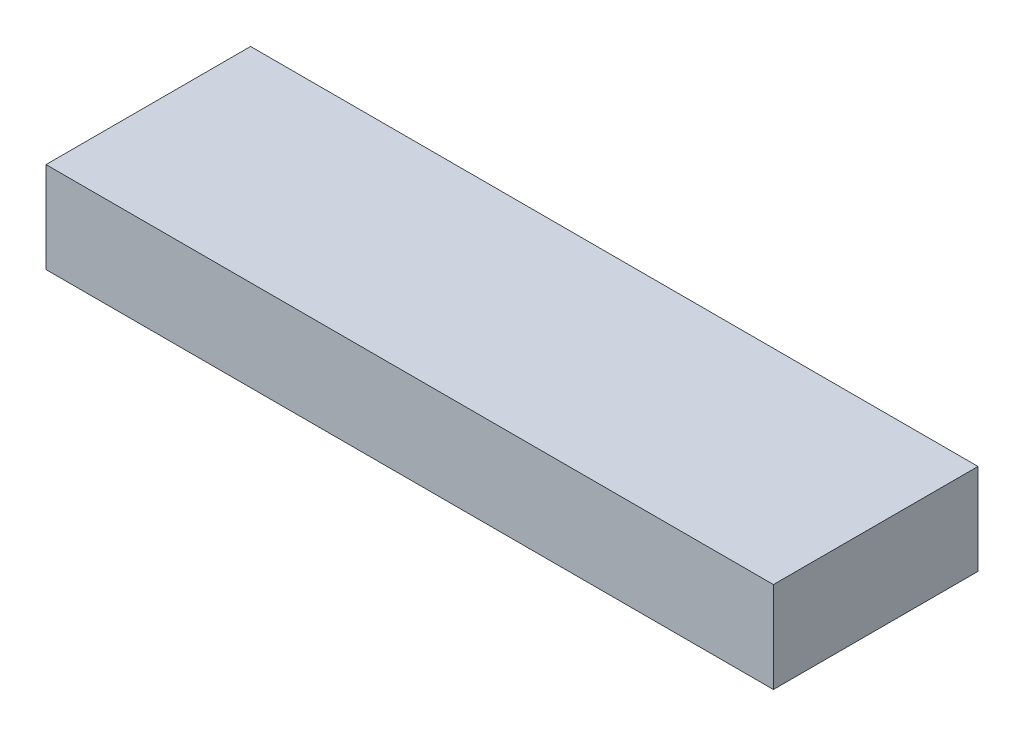
ISO-10303-21;
HEADER;
FILE_DESCRIPTION(('STEP AP214'),'2;1');
FILE_NAME('part.step','',(''),(''),'','','');
FILE_SCHEMA(('AUTOMOTIVE_DESIGN { 1 0 10303 214 1 1 1 1 }'));
ENDSEC;
DATA;
#1=APPLICATION_CONTEXT('core data for automotive mechanical design processes');
#2=APPLICATION_PROTOCOL_DEFINITION('international standard','automotive_design',2000,#1);
#3=PRODUCT_CONTEXT('',#1,'mechanical');
#4=PRODUCT('Part','Part','',(#3));
#5=PRODUCT_RELATED_PRODUCT_CATEGORY('part','',(#4));
#6=PRODUCT_DEFINITION_FORMATION('','',#4);
#7=PRODUCT_DEFINITION_CONTEXT('part definition',#1,'design');
#8=PRODUCT_DEFINITION('design','',#6,#7);
#9=PRODUCT_DEFINITION_SHAPE('','',#8);
#10=(LENGTH_UNIT() NAMED_UNIT(*) SI_UNIT(.MILLI.,.METRE.));
#11=(NAMED_UNIT(*) PLANE_ANGLE_UNIT() SI_UNIT($,.RADIAN.));
#12=(NAMED_UNIT(*) SI_UNIT($,.STERADIAN.) SOLID_ANGLE_UNIT());
#13=UNCERTAINTY_MEASURE_WITH_UNIT(LENGTH_MEASURE(1.E-05),#10,'distance_accuracy_value','');
#14=(GEOMETRIC_REPRESENTATION_CONTEXT(3) GLOBAL_UNCERTAINTY_ASSIGNED_CONTEXT((#13)) GLOBAL_UNIT_ASSIGNED_CONTEXT((#10,
#11,#12)) REPRESENTATION_CONTEXT('',''));
#15=CARTESIAN_POINT('',(0.,0.,0.));
#16=DIRECTION('',(0.,0.,1.));
#17=DIRECTION('',(1.,0.,0.));
#18=AXIS2_PLACEMENT_3D('',#15,#16,#17);
#19=CARTESIAN_POINT('',(-228.088766336441,-450.85,28.575));
#20=DIRECTION('',(1.,0.,0.));
#21=DIRECTION('',(0.,0.,-1.));
#22=AXIS2_PLACEMENT_3D('',#19,#20,#21);
#23=PLANE('',#22);
#24=DIRECTION('',(0.,-1.,0.));
#25=VECTOR('',#24,1.);
#26=CARTESIAN_POINT('',(-228.088766336441,-450.85,0.));
#27=LINE('',#26,#25);
#28=CARTESIAN_POINT('',(-228.088766336441,-450.85,0.));
#29=VERTEX_POINT('',#28);
#30=CARTESIAN_POINT('',(-228.088766336441,-463.55,0.));
#31=VERTEX_POINT('',#30);
#32=EDGE_CURVE('E96',#29,#31,#27,.T.);
#33=ORIENTED_EDGE('',*,*,#32,.T.);
#34=DIRECTION('',(0.,0.,-1.));
#35=VECTOR('',#34,1.);
#36=CARTESIAN_POINT('',(-228.088766336441,-463.55,28.575));
#37=LINE('',#36,#35);
#38=CARTESIAN_POINT('',(-228.088766336441,-463.55,28.575));
#39=VERTEX_POINT('',#38);
#40=EDGE_CURVE('E11',#39,#31,#37,.T.);
#41=ORIENTED_EDGE('',*,*,#40,.F.);
#42=DIRECTION('',(0.,-1.,0.));
#43=VECTOR('',#42,1.);
#44=CARTESIAN_POINT('',(-228.088766336441,-450.85,28.575));
#45=LINE('',#44,#43);
#46=CARTESIAN_POINT('',(-228.088766336441,-450.85,28.575));
#47=VERTEX_POINT('',#46);
#48=EDGE_CURVE('E82',#47,#39,#45,.T.);
#49=ORIENTED_EDGE('',*,*,#48,.F.);
#50=DIRECTION('',(0.,0.,-1.));
#51=VECTOR('',#50,1.);
#52=CARTESIAN_POINT('',(-228.088766336441,-450.85,28.575));
#53=LINE('',#52,#51);
#54=EDGE_CURVE('E49',#47,#29,#53,.T.);
#55=ORIENTED_EDGE('',*,*,#54,.T.);
#56=EDGE_LOOP('',(#33,#41,#49,#55));
#57=FACE_BOUND('',#56,.T.);
#58=ADVANCED_FACE('F33',(#57),#23,.F.);
#59=CARTESIAN_POINT('',(-228.088766336441,-463.55,28.575));
#60=DIRECTION('',(0.,1.,0.));
#61=DIRECTION('',(0.,0.,1.));
#62=AXIS2_PLACEMENT_3D('',#59,#60,#61);
#63=PLANE('',#62);
#64=DIRECTION('',(1.,0.,0.));
#65=VECTOR('',#64,1.);
#66=CARTESIAN_POINT('',(-228.088766336441,-463.55,0.));
#67=LINE('',#66,#65);
#68=CARTESIAN_POINT('',(-126.488766336441,-463.55,0.));
#69=VERTEX_POINT('',#68);
#70=EDGE_CURVE('E87',#31,#69,#67,.T.);
#71=ORIENTED_EDGE('',*,*,#70,.T.);
#72=DIRECTION('',(0.,0.,-1.));
#73=VECTOR('',#72,1.);
#74=CARTESIAN_POINT('',(-126.488766336441,-463.55,28.575));
#75=LINE('',#74,#73);
#76=CARTESIAN_POINT('',(-126.488766336441,-463.55,28.575));
#77=VERTEX_POINT('',#76);
#78=EDGE_CURVE('E41',#77,#69,#75,.T.);
#79=ORIENTED_EDGE('',*,*,#78,.F.);
#80=DIRECTION('',(1.,0.,0.));
#81=VECTOR('',#80,1.);
#82=CARTESIAN_POINT('',(-228.088766336441,-463.55,28.575));
#83=LINE('',#82,#81);
#84=EDGE_CURVE('E74',#39,#77,#83,.T.);
#85=ORIENTED_EDGE('',*,*,#84,.F.);
#86=ORIENTED_EDGE('',*,*,#40,.T.);
#87=EDGE_LOOP('',(#71,#79,#85,#86));
#88=FACE_BOUND('',#87,.T.);
#89=ADVANCED_FACE('F86',(#88),#63,.F.);
#90=CARTESIAN_POINT('',(-126.488766336441,-450.85,28.575));
#91=DIRECTION('',(1.,0.,0.));
#92=DIRECTION('',(0.,0.,-1.));
#93=AXIS2_PLACEMENT_3D('',#90,#91,#92);
#94=PLANE('',#93);
#95=DIRECTION('',(0.,-1.,0.));
#96=VECTOR('',#95,1.);
#97=CARTESIAN_POINT('',(-126.488766336441,-450.85,0.));
#98=LINE('',#97,#96);
#99=CARTESIAN_POINT('',(-126.488766336441,-450.85,0.));
#100=VERTEX_POINT('',#99);
#101=EDGE_CURVE('E99',#100,#69,#98,.T.);
#102=ORIENTED_EDGE('',*,*,#101,.F.);
#103=DIRECTION('',(0.,0.,-1.));
#104=VECTOR('',#103,1.);
#105=CARTESIAN_POINT('',(-126.488766336441,-450.85,28.575));
#106=LINE('',#105,#104);
#107=CARTESIAN_POINT('',(-126.488766336441,-450.85,28.575));
#108=VERTEX_POINT('',#107);
#109=EDGE_CURVE('E63',#108,#100,#106,.T.);
#110=ORIENTED_EDGE('',*,*,#109,.F.);
#111=DIRECTION('',(0.,-1.,0.));
#112=VECTOR('',#111,1.);
#113=CARTESIAN_POINT('',(-126.488766336441,-450.85,28.575));
#114=LINE('',#113,#112);
#115=EDGE_CURVE('E81',#108,#77,#114,.T.);
#116=ORIENTED_EDGE('',*,*,#115,.T.);
#117=ORIENTED_EDGE('',*,*,#78,.T.);
#118=EDGE_LOOP('',(#102,#110,#116,#117));
#119=FACE_BOUND('',#118,.T.);
#120=ADVANCED_FACE('F90',(#119),#94,.T.);
#121=CARTESIAN_POINT('',(-228.088766336441,-450.85,28.575));
#122=DIRECTION('',(0.,1.,0.));
#123=DIRECTION('',(0.,0.,1.));
#124=AXIS2_PLACEMENT_3D('',#121,#122,#123);
#125=PLANE('',#124);
#126=DIRECTION('',(1.,0.,0.));
#127=VECTOR('',#126,1.);
#128=CARTESIAN_POINT('',(-228.088766336441,-450.85,0.));
#129=LINE('',#128,#127);
#130=EDGE_CURVE('E101',#29,#100,#129,.T.);
#131=ORIENTED_EDGE('',*,*,#130,.F.);
#132=ORIENTED_EDGE('',*,*,#54,.F.);
#133=DIRECTION('',(1.,0.,0.));
#134=VECTOR('',#133,1.);
#135=CARTESIAN_POINT('',(-228.088766336441,-450.85,28.575));
#136=LINE('',#135,#134);
#137=EDGE_CURVE('E91',#47,#108,#136,.T.);
#138=ORIENTED_EDGE('',*,*,#137,.T.);
#139=ORIENTED_EDGE('',*,*,#109,.T.);
#140=EDGE_LOOP('',(#131,#132,#138,#139));
#141=FACE_BOUND('',#140,.T.);
#142=ADVANCED_FACE('F107',(#141),#125,.T.);
#143=CARTESIAN_POINT('',(0.,0.,28.575));
#144=DIRECTION('',(0.,0.,1.));
#145=DIRECTION('',(1.,0.,0.));
#146=AXIS2_PLACEMENT_3D('',#143,#144,#145);
#147=PLANE('',#146);
#148=ORIENTED_EDGE('',*,*,#48,.T.);
#149=ORIENTED_EDGE('',*,*,#84,.T.);
#150=ORIENTED_EDGE('',*,*,#115,.F.);
#151=ORIENTED_EDGE('',*,*,#137,.F.);
#152=EDGE_LOOP('',(#148,#149,#150,#151));
#153=FACE_BOUND('',#152,.T.);
#154=ADVANCED_FACE('F78',(#153),#147,.T.);
#155=CARTESIAN_POINT('',(0.,0.,0.));
#156=DIRECTION('',(0.,0.,1.));
#157=DIRECTION('',(1.,0.,0.));
#158=AXIS2_PLACEMENT_3D('',#155,#156,#157);
#159=PLANE('',#158);
#160=ORIENTED_EDGE('',*,*,#32,.F.);
#161=ORIENTED_EDGE('',*,*,#130,.T.);
#162=ORIENTED_EDGE('',*,*,#101,.T.);
#163=ORIENTED_EDGE('',*,*,#70,.F.);
#164=EDGE_LOOP('',(#160,#161,#162,#163));
#165=FACE_BOUND('',#164,.T.);
#166=ADVANCED_FACE('F106',(#165),#159,.F.);
#167=CLOSED_SHELL('',(#58,#89,#120,#142,#154,#166));
#168=MANIFOLD_SOLID_BREP('B2',#167);
#169=ADVANCED_BREP_SHAPE_REPRESENTATION('',(#18,#168),#14);
#170=SHAPE_DEFINITION_REPRESENTATION(#9,#169);
ENDSEC;
END-ISO-10303-21;
